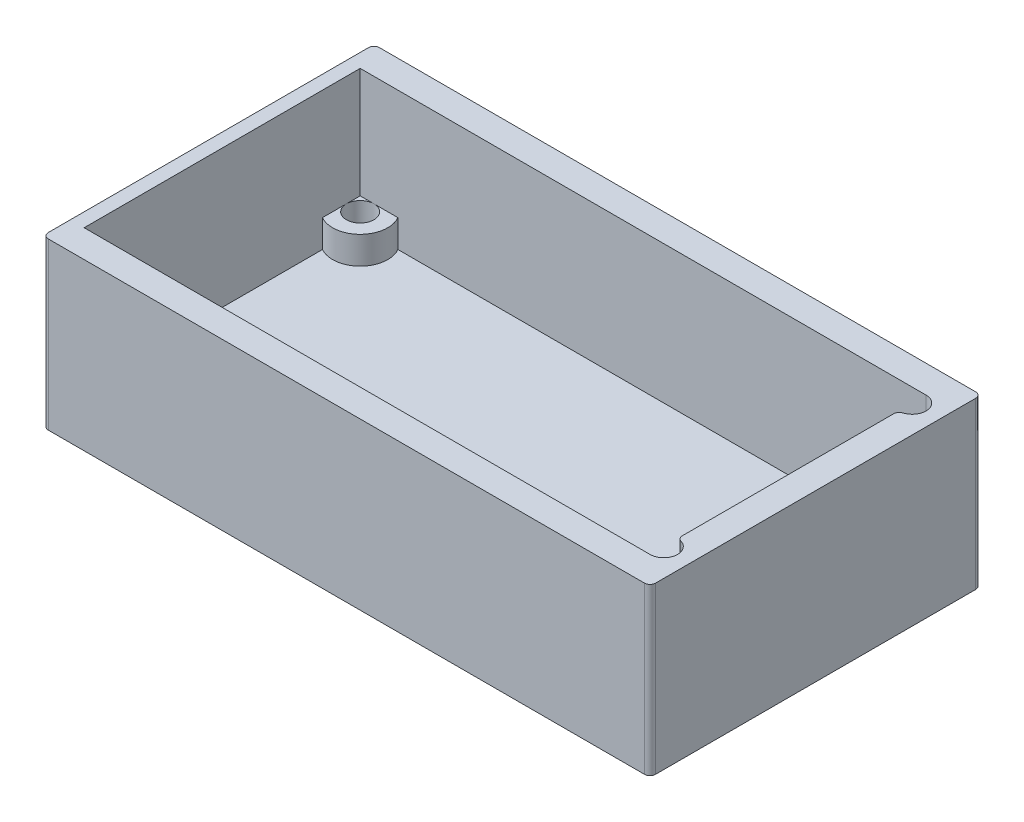
ISO-10303-21;
HEADER;
FILE_DESCRIPTION(('STEP AP214'),'2;1');
FILE_NAME('part.step','',(''),(''),'','','');
FILE_SCHEMA(('AUTOMOTIVE_DESIGN { 1 0 10303 214 1 1 1 1 }'));
ENDSEC;
DATA;
#1=APPLICATION_CONTEXT('core data for automotive mechanical design processes');
#2=APPLICATION_PROTOCOL_DEFINITION('international standard','automotive_design',2000,#1);
#3=PRODUCT_CONTEXT('',#1,'mechanical');
#4=PRODUCT('Part','Part','',(#3));
#5=PRODUCT_RELATED_PRODUCT_CATEGORY('part','',(#4));
#6=PRODUCT_DEFINITION_FORMATION('','',#4);
#7=PRODUCT_DEFINITION_CONTEXT('part definition',#1,'design');
#8=PRODUCT_DEFINITION('design','',#6,#7);
#9=PRODUCT_DEFINITION_SHAPE('','',#8);
#10=(LENGTH_UNIT() NAMED_UNIT(*) SI_UNIT(.MILLI.,.METRE.));
#11=(NAMED_UNIT(*) PLANE_ANGLE_UNIT() SI_UNIT($,.RADIAN.));
#12=(NAMED_UNIT(*) SI_UNIT($,.STERADIAN.) SOLID_ANGLE_UNIT());
#13=UNCERTAINTY_MEASURE_WITH_UNIT(LENGTH_MEASURE(1.E-05),#10,'distance_accuracy_value','');
#14=(GEOMETRIC_REPRESENTATION_CONTEXT(3) GLOBAL_UNCERTAINTY_ASSIGNED_CONTEXT((#13)) GLOBAL_UNIT_ASSIGNED_CONTEXT((#10,
#11,#12)) REPRESENTATION_CONTEXT('',''));
#15=CARTESIAN_POINT('',(0.,0.,0.));
#16=DIRECTION('',(0.,0.,1.));
#17=DIRECTION('',(1.,0.,0.));
#18=AXIS2_PLACEMENT_3D('',#15,#16,#17);
#19=CARTESIAN_POINT('',(10.,2.,-4.5));
#20=DIRECTION('',(0.,-1.,0.));
#21=DIRECTION('',(0.,0.,-1.));
#22=AXIS2_PLACEMENT_3D('',#19,#20,#21);
#23=CYLINDRICAL_SURFACE('',#22,0.500000000000001);
#24=CARTESIAN_POINT('',(10.,2.,-4.5));
#25=DIRECTION('',(0.,1.,0.));
#26=DIRECTION('',(0.,0.,1.));
#27=AXIS2_PLACEMENT_3D('',#24,#25,#26);
#28=CIRCLE('',#27,0.500000000000001);
#29=CARTESIAN_POINT('',(10.,2.,-5.));
#30=VERTEX_POINT('',#29);
#31=CARTESIAN_POINT('',(10.1428571428571,2.,-4.02084257625004));
#32=VERTEX_POINT('',#31);
#33=EDGE_CURVE('E49',#30,#32,#28,.T.);
#34=ORIENTED_EDGE('',*,*,#33,.T.);
#35=DIRECTION('',(0.,-1.,0.));
#36=VECTOR('',#35,1.);
#37=CARTESIAN_POINT('',(10.1428571428571,2.,-4.02084257625004));
#38=LINE('',#37,#36);
#39=CARTESIAN_POINT('',(10.1428571428571,6.,-4.02084257625004));
#40=VERTEX_POINT('',#39);
#41=EDGE_CURVE('E53',#32,#40,#38,.F.);
#42=ORIENTED_EDGE('',*,*,#41,.T.);
#43=CARTESIAN_POINT('',(10.,6.,-4.5));
#44=DIRECTION('',(0.,1.,0.));
#45=DIRECTION('',(0.,0.,1.));
#46=AXIS2_PLACEMENT_3D('',#43,#44,#45);
#47=CIRCLE('',#46,0.500000000000001);
#48=CARTESIAN_POINT('',(10.,6.,-5.));
#49=VERTEX_POINT('',#48);
#50=EDGE_CURVE('E230',#40,#49,#47,.T.);
#51=ORIENTED_EDGE('',*,*,#50,.T.);
#52=DIRECTION('',(0.,1.,0.));
#53=VECTOR('',#52,1.);
#54=CARTESIAN_POINT('',(10.,1.,-5.));
#55=LINE('',#54,#53);
#56=EDGE_CURVE('E248',#30,#49,#55,.T.);
#57=ORIENTED_EDGE('',*,*,#56,.F.);
#58=EDGE_LOOP('',(#34,#42,#51,#57));
#59=FACE_BOUND('',#58,.T.);
#60=CARTESIAN_POINT('',(10.,1.,-4.5));
#61=DIRECTION('',(0.,-1.,0.));
#62=DIRECTION('',(0.,0.,-1.));
#63=AXIS2_PLACEMENT_3D('',#60,#61,#62);
#64=CIRCLE('',#63,0.500000000000001);
#65=CARTESIAN_POINT('',(10.,1.,-5.));
#66=VERTEX_POINT('',#65);
#67=EDGE_CURVE('E36',#66,#66,#64,.T.);
#68=ORIENTED_EDGE('',*,*,#67,.T.);
#69=EDGE_LOOP('',(#68));
#70=FACE_BOUND('',#69,.T.);
#71=ADVANCED_FACE('F32',(#59,#70),#23,.F.);
#72=CARTESIAN_POINT('',(-10.,2.,-4.5));
#73=DIRECTION('',(0.,-1.,0.));
#74=DIRECTION('',(0.,0.,-1.));
#75=AXIS2_PLACEMENT_3D('',#72,#73,#74);
#76=CYLINDRICAL_SURFACE('',#75,0.499999999999999);
#77=CARTESIAN_POINT('',(-10.,2.,-4.5));
#78=DIRECTION('',(0.,1.,0.));
#79=DIRECTION('',(0.,0.,1.));
#80=AXIS2_PLACEMENT_3D('',#77,#78,#79);
#81=CIRCLE('',#80,0.499999999999999);
#82=CARTESIAN_POINT('',(-10.,2.,-5.));
#83=VERTEX_POINT('',#82);
#84=CARTESIAN_POINT('',(-10.5,2.,-4.5));
#85=VERTEX_POINT('',#84);
#86=EDGE_CURVE('E392',#83,#85,#81,.T.);
#87=ORIENTED_EDGE('',*,*,#86,.T.);
#88=EDGE_CURVE('E396',#85,#83,#81,.T.);
#89=ORIENTED_EDGE('',*,*,#88,.T.);
#90=EDGE_LOOP('',(#87,#89));
#91=FACE_BOUND('',#90,.T.);
#92=CARTESIAN_POINT('',(-10.,1.,-4.5));
#93=DIRECTION('',(0.,-1.,0.));
#94=DIRECTION('',(0.,0.,-1.));
#95=AXIS2_PLACEMENT_3D('',#92,#93,#94);
#96=CIRCLE('',#95,0.499999999999999);
#97=CARTESIAN_POINT('',(-10.,1.,-5.));
#98=VERTEX_POINT('',#97);
#99=EDGE_CURVE('E350',#98,#98,#96,.T.);
#100=ORIENTED_EDGE('',*,*,#99,.T.);
#101=EDGE_LOOP('',(#100));
#102=FACE_BOUND('',#101,.T.);
#103=ADVANCED_FACE('F502',(#91,#102),#76,.F.);
#104=CARTESIAN_POINT('',(-10.,2.,4.5));
#105=DIRECTION('',(0.,-1.,0.));
#106=DIRECTION('',(0.,0.,-1.));
#107=AXIS2_PLACEMENT_3D('',#104,#105,#106);
#108=CYLINDRICAL_SURFACE('',#107,0.499999999999999);
#109=CARTESIAN_POINT('',(-10.,2.,4.5));
#110=DIRECTION('',(0.,-1.,0.));
#111=DIRECTION('',(0.,0.,-1.));
#112=AXIS2_PLACEMENT_3D('',#109,#110,#111);
#113=CIRCLE('',#112,0.499999999999999);
#114=CARTESIAN_POINT('',(-10.,2.,5.));
#115=VERTEX_POINT('',#114);
#116=CARTESIAN_POINT('',(-10.5,2.,4.5));
#117=VERTEX_POINT('',#116);
#118=EDGE_CURVE('E377',#115,#117,#113,.T.);
#119=ORIENTED_EDGE('',*,*,#118,.F.);
#120=EDGE_CURVE('E376',#117,#115,#113,.T.);
#121=ORIENTED_EDGE('',*,*,#120,.F.);
#122=EDGE_LOOP('',(#119,#121));
#123=FACE_BOUND('',#122,.T.);
#124=CARTESIAN_POINT('',(-10.,1.,4.5));
#125=DIRECTION('',(0.,-1.,0.));
#126=DIRECTION('',(0.,0.,-1.));
#127=AXIS2_PLACEMENT_3D('',#124,#125,#126);
#128=CIRCLE('',#127,0.499999999999999);
#129=CARTESIAN_POINT('',(-10.,1.,4.));
#130=VERTEX_POINT('',#129);
#131=EDGE_CURVE('E346',#130,#130,#128,.F.);
#132=ORIENTED_EDGE('',*,*,#131,.F.);
#133=EDGE_LOOP('',(#132));
#134=FACE_BOUND('',#133,.T.);
#135=ADVANCED_FACE('F522',(#123,#134),#108,.F.);
#136=CARTESIAN_POINT('',(10.,2.,4.5));
#137=DIRECTION('',(0.,-1.,0.));
#138=DIRECTION('',(0.,0.,-1.));
#139=AXIS2_PLACEMENT_3D('',#136,#137,#138);
#140=CYLINDRICAL_SURFACE('',#139,0.500000000000001);
#141=CARTESIAN_POINT('',(10.,6.,4.5));
#142=DIRECTION('',(0.,-1.,0.));
#143=DIRECTION('',(0.,0.,-1.));
#144=AXIS2_PLACEMENT_3D('',#141,#142,#143);
#145=CIRCLE('',#144,0.500000000000001);
#146=CARTESIAN_POINT('',(10.1428571428571,6.,4.02084257625004));
#147=VERTEX_POINT('',#146);
#148=CARTESIAN_POINT('',(10.,6.,5.));
#149=VERTEX_POINT('',#148);
#150=EDGE_CURVE('E221',#147,#149,#145,.T.);
#151=ORIENTED_EDGE('',*,*,#150,.F.);
#152=DIRECTION('',(0.,-1.,0.));
#153=VECTOR('',#152,1.);
#154=CARTESIAN_POINT('',(10.1428571428571,2.,4.02084257625004));
#155=LINE('',#154,#153);
#156=CARTESIAN_POINT('',(10.1428571428571,2.,4.02084257625004));
#157=VERTEX_POINT('',#156);
#158=EDGE_CURVE('E331',#147,#157,#155,.T.);
#159=ORIENTED_EDGE('',*,*,#158,.T.);
#160=CARTESIAN_POINT('',(10.,2.,4.5));
#161=DIRECTION('',(0.,-1.,0.));
#162=DIRECTION('',(0.,0.,-1.));
#163=AXIS2_PLACEMENT_3D('',#160,#161,#162);
#164=CIRCLE('',#163,0.500000000000001);
#165=CARTESIAN_POINT('',(10.,2.,5.));
#166=VERTEX_POINT('',#165);
#167=EDGE_CURVE('E236',#166,#157,#164,.T.);
#168=ORIENTED_EDGE('',*,*,#167,.F.);
#169=DIRECTION('',(0.,1.,0.));
#170=VECTOR('',#169,1.);
#171=CARTESIAN_POINT('',(10.,1.,5.));
#172=LINE('',#171,#170);
#173=EDGE_CURVE('E210',#166,#149,#172,.T.);
#174=ORIENTED_EDGE('',*,*,#173,.T.);
#175=EDGE_LOOP('',(#151,#159,#168,#174));
#176=FACE_BOUND('',#175,.T.);
#177=CARTESIAN_POINT('',(10.,1.,4.5));
#178=DIRECTION('',(0.,-1.,0.));
#179=DIRECTION('',(0.,0.,-1.));
#180=AXIS2_PLACEMENT_3D('',#177,#178,#179);
#181=CIRCLE('',#180,0.500000000000001);
#182=CARTESIAN_POINT('',(10.,1.,4.));
#183=VERTEX_POINT('',#182);
#184=EDGE_CURVE('E231',#183,#183,#181,.F.);
#185=ORIENTED_EDGE('',*,*,#184,.F.);
#186=EDGE_LOOP('',(#185));
#187=FACE_BOUND('',#186,.T.);
#188=ADVANCED_FACE('F234',(#176,#187),#140,.F.);
#189=CARTESIAN_POINT('',(10.,1.,5.));
#190=DIRECTION('',(1.,0.,0.));
#191=DIRECTION('',(0.,0.,-1.));
#192=AXIS2_PLACEMENT_3D('',#189,#190,#191);
#193=PLANE('',#192);
#194=DIRECTION('',(0.,0.,1.));
#195=VECTOR('',#194,1.);
#196=CARTESIAN_POINT('',(10.,2.,5.));
#197=LINE('',#196,#195);
#198=CARTESIAN_POINT('',(10.,2.,3.5));
#199=VERTEX_POINT('',#198);
#200=CARTESIAN_POINT('',(10.,2.,3.82917960675006));
#201=VERTEX_POINT('',#200);
#202=EDGE_CURVE('E417',#199,#201,#197,.T.);
#203=ORIENTED_EDGE('',*,*,#202,.T.);
#204=DIRECTION('',(0.,-1.,0.));
#205=VECTOR('',#204,1.);
#206=CARTESIAN_POINT('',(10.,1.,3.82917960675006));
#207=LINE('',#206,#205);
#208=CARTESIAN_POINT('',(10.,6.,3.82917960675006));
#209=VERTEX_POINT('',#208);
#210=EDGE_CURVE('E336',#201,#209,#207,.F.);
#211=ORIENTED_EDGE('',*,*,#210,.T.);
#212=DIRECTION('',(0.,0.,-1.));
#213=VECTOR('',#212,1.);
#214=CARTESIAN_POINT('',(10.,6.,5.));
#215=LINE('',#214,#213);
#216=CARTESIAN_POINT('',(10.,6.,-3.82917960675006));
#217=VERTEX_POINT('',#216);
#218=EDGE_CURVE('E431',#209,#217,#215,.T.);
#219=ORIENTED_EDGE('',*,*,#218,.T.);
#220=DIRECTION('',(0.,1.,0.));
#221=VECTOR('',#220,1.);
#222=CARTESIAN_POINT('',(10.,2.,-3.82917960675006));
#223=LINE('',#222,#221);
#224=CARTESIAN_POINT('',(10.,2.,-3.82917960675006));
#225=VERTEX_POINT('',#224);
#226=EDGE_CURVE('E333',#217,#225,#223,.F.);
#227=ORIENTED_EDGE('',*,*,#226,.T.);
#228=DIRECTION('',(0.,0.,1.));
#229=VECTOR('',#228,1.);
#230=CARTESIAN_POINT('',(10.,2.,5.));
#231=LINE('',#230,#229);
#232=CARTESIAN_POINT('',(10.,2.,-3.5));
#233=VERTEX_POINT('',#232);
#234=EDGE_CURVE('E429',#225,#233,#231,.T.);
#235=ORIENTED_EDGE('',*,*,#234,.T.);
#236=DIRECTION('',(0.,-1.,0.));
#237=VECTOR('',#236,1.);
#238=CARTESIAN_POINT('',(10.,2.,-3.5));
#239=LINE('',#238,#237);
#240=CARTESIAN_POINT('',(10.,1.,-3.5));
#241=VERTEX_POINT('',#240);
#242=EDGE_CURVE('E426',#241,#233,#239,.F.);
#243=ORIENTED_EDGE('',*,*,#242,.F.);
#244=DIRECTION('',(0.,0.,-1.));
#245=VECTOR('',#244,1.);
#246=CARTESIAN_POINT('',(10.,1.,5.));
#247=LINE('',#246,#245);
#248=CARTESIAN_POINT('',(10.,1.,3.5));
#249=VERTEX_POINT('',#248);
#250=EDGE_CURVE('E217',#249,#241,#247,.T.);
#251=ORIENTED_EDGE('',*,*,#250,.F.);
#252=DIRECTION('',(0.,-1.,0.));
#253=VECTOR('',#252,1.);
#254=CARTESIAN_POINT('',(10.,2.,3.5));
#255=LINE('',#254,#253);
#256=EDGE_CURVE('E415',#249,#199,#255,.F.);
#257=ORIENTED_EDGE('',*,*,#256,.T.);
#258=EDGE_LOOP('',(#203,#211,#219,#227,#235,#243,#251,#257));
#259=FACE_BOUND('',#258,.T.);
#260=ADVANCED_FACE('F460',(#259),#193,.F.);
#261=CARTESIAN_POINT('',(-10.5,1.,-5.));
#262=DIRECTION('',(0.,0.,-1.));
#263=DIRECTION('',(-1.,0.,0.));
#264=AXIS2_PLACEMENT_3D('',#261,#262,#263);
#265=PLANE('',#264);
#266=DIRECTION('',(-1.,0.,0.));
#267=VECTOR('',#266,1.);
#268=CARTESIAN_POINT('',(-10.5,6.,-5.));
#269=LINE('',#268,#267);
#270=CARTESIAN_POINT('',(-10.5,6.,-5.));
#271=VERTEX_POINT('',#270);
#272=EDGE_CURVE('E441',#49,#271,#269,.T.);
#273=ORIENTED_EDGE('',*,*,#272,.T.);
#274=DIRECTION('',(0.,1.,0.));
#275=VECTOR('',#274,1.);
#276=CARTESIAN_POINT('',(-10.5,1.,-5.));
#277=LINE('',#276,#275);
#278=CARTESIAN_POINT('',(-10.5,2.,-5.));
#279=VERTEX_POINT('',#278);
#280=EDGE_CURVE('E242',#279,#271,#277,.T.);
#281=ORIENTED_EDGE('',*,*,#280,.F.);
#282=DIRECTION('',(1.,0.,0.));
#283=VECTOR('',#282,1.);
#284=CARTESIAN_POINT('',(-10.5,2.,-5.));
#285=LINE('',#284,#283);
#286=EDGE_CURVE('E323',#279,#83,#285,.T.);
#287=ORIENTED_EDGE('',*,*,#286,.T.);
#288=CARTESIAN_POINT('',(-9.13397459621556,2.,-5.));
#289=VERTEX_POINT('',#288);
#290=EDGE_CURVE('E321',#83,#289,#285,.T.);
#291=ORIENTED_EDGE('',*,*,#290,.T.);
#292=DIRECTION('',(0.,-1.,0.));
#293=VECTOR('',#292,1.);
#294=CARTESIAN_POINT('',(-9.13397459621556,2.,-5.));
#295=LINE('',#294,#293);
#296=CARTESIAN_POINT('',(-9.13397459621556,1.,-5.));
#297=VERTEX_POINT('',#296);
#298=EDGE_CURVE('E399',#297,#289,#295,.F.);
#299=ORIENTED_EDGE('',*,*,#298,.F.);
#300=DIRECTION('',(-1.,0.,0.));
#301=VECTOR('',#300,1.);
#302=CARTESIAN_POINT('',(-10.5,1.,-5.));
#303=LINE('',#302,#301);
#304=CARTESIAN_POINT('',(9.13397459621556,1.,-5.));
#305=VERTEX_POINT('',#304);
#306=EDGE_CURVE('E433',#305,#297,#303,.T.);
#307=ORIENTED_EDGE('',*,*,#306,.F.);
#308=DIRECTION('',(0.,-1.,0.));
#309=VECTOR('',#308,1.);
#310=CARTESIAN_POINT('',(9.13397459621556,2.,-5.));
#311=LINE('',#310,#309);
#312=CARTESIAN_POINT('',(9.13397459621556,2.,-5.));
#313=VERTEX_POINT('',#312);
#314=EDGE_CURVE('E424',#313,#305,#311,.T.);
#315=ORIENTED_EDGE('',*,*,#314,.F.);
#316=DIRECTION('',(1.,0.,0.));
#317=VECTOR('',#316,1.);
#318=CARTESIAN_POINT('',(-10.5,2.,-5.));
#319=LINE('',#318,#317);
#320=EDGE_CURVE('E311',#313,#30,#319,.T.);
#321=ORIENTED_EDGE('',*,*,#320,.T.);
#322=ORIENTED_EDGE('',*,*,#56,.T.);
#323=EDGE_LOOP('',(#273,#281,#287,#291,#299,#307,#315,#321,#322));
#324=FACE_BOUND('',#323,.T.);
#325=ADVANCED_FACE('F449',(#324),#265,.F.);
#326=CARTESIAN_POINT('',(11.,6.,6.));
#327=DIRECTION('',(-1.,0.,0.));
#328=DIRECTION('',(0.,0.,1.));
#329=AXIS2_PLACEMENT_3D('',#326,#327,#328);
#330=PLANE('',#329);
#331=DIRECTION('',(0.,0.,-1.));
#332=VECTOR('',#331,1.);
#333=CARTESIAN_POINT('',(11.,0.,6.));
#334=LINE('',#333,#332);
#335=CARTESIAN_POINT('',(11.,0.,5.8));
#336=VERTEX_POINT('',#335);
#337=CARTESIAN_POINT('',(11.,0.,-5.8));
#338=VERTEX_POINT('',#337);
#339=EDGE_CURVE('E237',#336,#338,#334,.T.);
#340=ORIENTED_EDGE('',*,*,#339,.T.);
#341=DIRECTION('',(0.,-1.,0.));
#342=VECTOR('',#341,1.);
#343=CARTESIAN_POINT('',(11.,6.,-5.8));
#344=LINE('',#343,#342);
#345=CARTESIAN_POINT('',(11.,6.,-5.8));
#346=VERTEX_POINT('',#345);
#347=EDGE_CURVE('E301',#338,#346,#344,.F.);
#348=ORIENTED_EDGE('',*,*,#347,.T.);
#349=DIRECTION('',(0.,0.,-1.));
#350=VECTOR('',#349,1.);
#351=CARTESIAN_POINT('',(11.,6.,6.));
#352=LINE('',#351,#350);
#353=CARTESIAN_POINT('',(11.,6.,5.8));
#354=VERTEX_POINT('',#353);
#355=EDGE_CURVE('E252',#354,#346,#352,.T.);
#356=ORIENTED_EDGE('',*,*,#355,.F.);
#357=DIRECTION('',(0.,-1.,0.));
#358=VECTOR('',#357,1.);
#359=CARTESIAN_POINT('',(11.,6.,5.8));
#360=LINE('',#359,#358);
#361=EDGE_CURVE('E298',#354,#336,#360,.T.);
#362=ORIENTED_EDGE('',*,*,#361,.T.);
#363=EDGE_LOOP('',(#340,#348,#356,#362));
#364=FACE_BOUND('',#363,.T.);
#365=ADVANCED_FACE('F538',(#364),#330,.F.);
#366=CARTESIAN_POINT('',(-11.,6.,-6.));
#367=DIRECTION('',(0.,0.,1.));
#368=DIRECTION('',(1.,0.,0.));
#369=AXIS2_PLACEMENT_3D('',#366,#367,#368);
#370=PLANE('',#369);
#371=DIRECTION('',(-1.,0.,0.));
#372=VECTOR('',#371,1.);
#373=CARTESIAN_POINT('',(-11.,0.,-6.));
#374=LINE('',#373,#372);
#375=CARTESIAN_POINT('',(10.8,0.,-6.));
#376=VERTEX_POINT('',#375);
#377=CARTESIAN_POINT('',(-10.8,0.,-6.));
#378=VERTEX_POINT('',#377);
#379=EDGE_CURVE('E240',#376,#378,#374,.T.);
#380=ORIENTED_EDGE('',*,*,#379,.T.);
#381=DIRECTION('',(0.,-1.,0.));
#382=VECTOR('',#381,1.);
#383=CARTESIAN_POINT('',(-10.8,6.,-6.));
#384=LINE('',#383,#382);
#385=CARTESIAN_POINT('',(-10.8,6.,-6.));
#386=VERTEX_POINT('',#385);
#387=EDGE_CURVE('E288',#378,#386,#384,.F.);
#388=ORIENTED_EDGE('',*,*,#387,.T.);
#389=DIRECTION('',(-1.,0.,0.));
#390=VECTOR('',#389,1.);
#391=CARTESIAN_POINT('',(-11.,6.,-6.));
#392=LINE('',#391,#390);
#393=CARTESIAN_POINT('',(10.8,6.,-6.));
#394=VERTEX_POINT('',#393);
#395=EDGE_CURVE('E255',#394,#386,#392,.T.);
#396=ORIENTED_EDGE('',*,*,#395,.F.);
#397=DIRECTION('',(0.,-1.,0.));
#398=VECTOR('',#397,1.);
#399=CARTESIAN_POINT('',(10.8,6.,-6.));
#400=LINE('',#399,#398);
#401=EDGE_CURVE('E285',#394,#376,#400,.T.);
#402=ORIENTED_EDGE('',*,*,#401,.T.);
#403=EDGE_LOOP('',(#380,#388,#396,#402));
#404=FACE_BOUND('',#403,.T.);
#405=ADVANCED_FACE('F555',(#404),#370,.F.);
#406=CARTESIAN_POINT('',(-11.,6.,6.));
#407=DIRECTION('',(1.,0.,0.));
#408=DIRECTION('',(0.,0.,-1.));
#409=AXIS2_PLACEMENT_3D('',#406,#407,#408);
#410=PLANE('',#409);
#411=DIRECTION('',(0.,0.,1.));
#412=VECTOR('',#411,1.);
#413=CARTESIAN_POINT('',(-11.,6.,6.));
#414=LINE('',#413,#412);
#415=CARTESIAN_POINT('',(-11.,6.,-5.8));
#416=VERTEX_POINT('',#415);
#417=CARTESIAN_POINT('',(-11.,6.,5.8));
#418=VERTEX_POINT('',#417);
#419=EDGE_CURVE('E259',#416,#418,#414,.T.);
#420=ORIENTED_EDGE('',*,*,#419,.F.);
#421=DIRECTION('',(0.,-1.,0.));
#422=VECTOR('',#421,1.);
#423=CARTESIAN_POINT('',(-11.,6.,-5.8));
#424=LINE('',#423,#422);
#425=CARTESIAN_POINT('',(-11.,0.,-5.8));
#426=VERTEX_POINT('',#425);
#427=EDGE_CURVE('E274',#416,#426,#424,.T.);
#428=ORIENTED_EDGE('',*,*,#427,.T.);
#429=DIRECTION('',(0.,0.,1.));
#430=VECTOR('',#429,1.);
#431=CARTESIAN_POINT('',(-11.,0.,6.));
#432=LINE('',#431,#430);
#433=CARTESIAN_POINT('',(-11.,0.,5.8));
#434=VERTEX_POINT('',#433);
#435=EDGE_CURVE('E268',#426,#434,#432,.T.);
#436=ORIENTED_EDGE('',*,*,#435,.T.);
#437=DIRECTION('',(0.,-1.,0.));
#438=VECTOR('',#437,1.);
#439=CARTESIAN_POINT('',(-11.,6.,5.8));
#440=LINE('',#439,#438);
#441=EDGE_CURVE('E264',#434,#418,#440,.F.);
#442=ORIENTED_EDGE('',*,*,#441,.T.);
#443=EDGE_LOOP('',(#420,#428,#436,#442));
#444=FACE_BOUND('',#443,.T.);
#445=ADVANCED_FACE('F551',(#444),#410,.F.);
#446=CARTESIAN_POINT('',(-11.,6.,6.));
#447=DIRECTION('',(0.,0.,-1.));
#448=DIRECTION('',(-1.,0.,0.));
#449=AXIS2_PLACEMENT_3D('',#446,#447,#448);
#450=PLANE('',#449);
#451=DIRECTION('',(1.,0.,0.));
#452=VECTOR('',#451,1.);
#453=CARTESIAN_POINT('',(-11.,0.,6.));
#454=LINE('',#453,#452);
#455=CARTESIAN_POINT('',(-10.8,0.,6.));
#456=VERTEX_POINT('',#455);
#457=CARTESIAN_POINT('',(10.8,0.,6.));
#458=VERTEX_POINT('',#457);
#459=EDGE_CURVE('E256',#456,#458,#454,.T.);
#460=ORIENTED_EDGE('',*,*,#459,.T.);
#461=DIRECTION('',(0.,-1.,0.));
#462=VECTOR('',#461,1.);
#463=CARTESIAN_POINT('',(10.8,6.,6.));
#464=LINE('',#463,#462);
#465=CARTESIAN_POINT('',(10.8,6.,6.));
#466=VERTEX_POINT('',#465);
#467=EDGE_CURVE('E306',#458,#466,#464,.F.);
#468=ORIENTED_EDGE('',*,*,#467,.T.);
#469=DIRECTION('',(1.,0.,0.));
#470=VECTOR('',#469,1.);
#471=CARTESIAN_POINT('',(-11.,6.,6.));
#472=LINE('',#471,#470);
#473=CARTESIAN_POINT('',(-10.8,6.,6.));
#474=VERTEX_POINT('',#473);
#475=EDGE_CURVE('E262',#474,#466,#472,.T.);
#476=ORIENTED_EDGE('',*,*,#475,.F.);
#477=DIRECTION('',(0.,-1.,0.));
#478=VECTOR('',#477,1.);
#479=CARTESIAN_POINT('',(-10.8,6.,6.));
#480=LINE('',#479,#478);
#481=EDGE_CURVE('E303',#474,#456,#480,.T.);
#482=ORIENTED_EDGE('',*,*,#481,.T.);
#483=EDGE_LOOP('',(#460,#468,#476,#482));
#484=FACE_BOUND('',#483,.T.);
#485=ADVANCED_FACE('F544',(#484),#450,.F.);
#486=CARTESIAN_POINT('',(0.,6.,0.));
#487=DIRECTION('',(0.,-1.,0.));
#488=DIRECTION('',(0.,0.,-1.));
#489=AXIS2_PLACEMENT_3D('',#486,#487,#488);
#490=PLANE('',#489);
#491=ORIENTED_EDGE('',*,*,#218,.F.);
#492=CARTESIAN_POINT('',(10.2,6.,3.82917960675006));
#493=DIRECTION('',(0.,-1.,0.));
#494=DIRECTION('',(0.,0.,-1.));
#495=AXIS2_PLACEMENT_3D('',#492,#493,#494);
#496=CIRCLE('',#495,0.2);
#497=EDGE_CURVE('E226',#209,#147,#496,.F.);
#498=ORIENTED_EDGE('',*,*,#497,.T.);
#499=ORIENTED_EDGE('',*,*,#150,.T.);
#500=DIRECTION('',(1.,0.,0.));
#501=VECTOR('',#500,1.);
#502=CARTESIAN_POINT('',(-10.5,6.,5.));
#503=LINE('',#502,#501);
#504=CARTESIAN_POINT('',(-10.5,6.,5.));
#505=VERTEX_POINT('',#504);
#506=EDGE_CURVE('E205',#505,#149,#503,.T.);
#507=ORIENTED_EDGE('',*,*,#506,.F.);
#508=DIRECTION('',(0.,0.,1.));
#509=VECTOR('',#508,1.);
#510=CARTESIAN_POINT('',(-10.5,6.,5.));
#511=LINE('',#510,#509);
#512=EDGE_CURVE('E218',#271,#505,#511,.T.);
#513=ORIENTED_EDGE('',*,*,#512,.F.);
#514=ORIENTED_EDGE('',*,*,#272,.F.);
#515=ORIENTED_EDGE('',*,*,#50,.F.);
#516=CARTESIAN_POINT('',(10.2,6.,-3.82917960675006));
#517=DIRECTION('',(0.,-1.,0.));
#518=DIRECTION('',(0.,0.,-1.));
#519=AXIS2_PLACEMENT_3D('',#516,#517,#518);
#520=CIRCLE('',#519,0.2);
#521=EDGE_CURVE('E338',#40,#217,#520,.F.);
#522=ORIENTED_EDGE('',*,*,#521,.T.);
#523=EDGE_LOOP('',(#491,#498,#499,#507,#513,#514,#515,#522));
#524=FACE_BOUND('',#523,.T.);
#525=ORIENTED_EDGE('',*,*,#395,.T.);
#526=CARTESIAN_POINT('',(-10.8,6.,-5.8));
#527=DIRECTION('',(0.,-1.,0.));
#528=DIRECTION('',(0.,0.,-1.));
#529=AXIS2_PLACEMENT_3D('',#526,#527,#528);
#530=CIRCLE('',#529,0.2);
#531=EDGE_CURVE('E296',#386,#416,#530,.F.);
#532=ORIENTED_EDGE('',*,*,#531,.T.);
#533=ORIENTED_EDGE('',*,*,#419,.T.);
#534=CARTESIAN_POINT('',(-10.8,6.,5.8));
#535=DIRECTION('',(0.,-1.,0.));
#536=DIRECTION('',(0.,0.,-1.));
#537=AXIS2_PLACEMENT_3D('',#534,#535,#536);
#538=CIRCLE('',#537,0.2);
#539=EDGE_CURVE('E290',#418,#474,#538,.F.);
#540=ORIENTED_EDGE('',*,*,#539,.T.);
#541=ORIENTED_EDGE('',*,*,#475,.T.);
#542=CARTESIAN_POINT('',(10.8,6.,5.8));
#543=DIRECTION('',(0.,-1.,0.));
#544=DIRECTION('',(0.,0.,-1.));
#545=AXIS2_PLACEMENT_3D('',#542,#543,#544);
#546=CIRCLE('',#545,0.2);
#547=EDGE_CURVE('E292',#466,#354,#546,.F.);
#548=ORIENTED_EDGE('',*,*,#547,.T.);
#549=ORIENTED_EDGE('',*,*,#355,.T.);
#550=CARTESIAN_POINT('',(10.8,6.,-5.8));
#551=DIRECTION('',(0.,-1.,0.));
#552=DIRECTION('',(0.,0.,-1.));
#553=AXIS2_PLACEMENT_3D('',#550,#551,#552);
#554=CIRCLE('',#553,0.2);
#555=EDGE_CURVE('E294',#346,#394,#554,.F.);
#556=ORIENTED_EDGE('',*,*,#555,.T.);
#557=EDGE_LOOP('',(#525,#532,#533,#540,#541,#548,#549,#556));
#558=FACE_BOUND('',#557,.T.);
#559=ADVANCED_FACE('F223',(#524,#558),#490,.F.);
#560=CARTESIAN_POINT('',(0.,0.,0.));
#561=DIRECTION('',(0.,-1.,0.));
#562=DIRECTION('',(0.,0.,-1.));
#563=AXIS2_PLACEMENT_3D('',#560,#561,#562);
#564=PLANE('',#563);
#565=CARTESIAN_POINT('',(10.,0.,-4.5));
#566=DIRECTION('',(0.,1.,0.));
#567=DIRECTION('',(0.,0.,1.));
#568=AXIS2_PLACEMENT_3D('',#565,#566,#567);
#569=CIRCLE('',#568,0.9);
#570=CARTESIAN_POINT('',(10.,0.,-3.6));
#571=VERTEX_POINT('',#570);
#572=EDGE_CURVE('E366',#571,#571,#569,.T.);
#573=ORIENTED_EDGE('',*,*,#572,.T.);
#574=EDGE_LOOP('',(#573));
#575=FACE_BOUND('',#574,.T.);
#576=CARTESIAN_POINT('',(-10.,0.,-4.5));
#577=DIRECTION('',(0.,-1.,0.));
#578=DIRECTION('',(0.,0.,1.));
#579=AXIS2_PLACEMENT_3D('',#576,#577,#578);
#580=CIRCLE('',#579,0.9);
#581=CARTESIAN_POINT('',(-10.,0.,-3.6));
#582=VERTEX_POINT('',#581);
#583=EDGE_CURVE('E359',#582,#582,#580,.T.);
#584=ORIENTED_EDGE('',*,*,#583,.F.);
#585=EDGE_LOOP('',(#584));
#586=FACE_BOUND('',#585,.T.);
#587=CARTESIAN_POINT('',(-10.,0.,4.5));
#588=DIRECTION('',(0.,1.,0.));
#589=DIRECTION('',(0.,0.,-1.));
#590=AXIS2_PLACEMENT_3D('',#587,#588,#589);
#591=CIRCLE('',#590,0.9);
#592=CARTESIAN_POINT('',(-10.,0.,3.6));
#593=VERTEX_POINT('',#592);
#594=EDGE_CURVE('E352',#593,#593,#591,.T.);
#595=ORIENTED_EDGE('',*,*,#594,.T.);
#596=EDGE_LOOP('',(#595));
#597=FACE_BOUND('',#596,.T.);
#598=CARTESIAN_POINT('',(10.,0.,4.5));
#599=DIRECTION('',(0.,-1.,0.));
#600=DIRECTION('',(0.,0.,-1.));
#601=AXIS2_PLACEMENT_3D('',#598,#599,#600);
#602=CIRCLE('',#601,0.9);
#603=CARTESIAN_POINT('',(10.,0.,3.6));
#604=VERTEX_POINT('',#603);
#605=EDGE_CURVE('E348',#604,#604,#602,.T.);
#606=ORIENTED_EDGE('',*,*,#605,.F.);
#607=EDGE_LOOP('',(#606));
#608=FACE_BOUND('',#607,.T.);
#609=ORIENTED_EDGE('',*,*,#435,.F.);
#610=CARTESIAN_POINT('',(-10.8,0.,-5.8));
#611=DIRECTION('',(0.,-1.,0.));
#612=DIRECTION('',(0.,0.,-1.));
#613=AXIS2_PLACEMENT_3D('',#610,#611,#612);
#614=CIRCLE('',#613,0.2);
#615=EDGE_CURVE('E283',#426,#378,#614,.T.);
#616=ORIENTED_EDGE('',*,*,#615,.T.);
#617=ORIENTED_EDGE('',*,*,#379,.F.);
#618=CARTESIAN_POINT('',(10.8,0.,-5.8));
#619=DIRECTION('',(0.,-1.,0.));
#620=DIRECTION('',(0.,0.,-1.));
#621=AXIS2_PLACEMENT_3D('',#618,#619,#620);
#622=CIRCLE('',#621,0.2);
#623=EDGE_CURVE('E281',#376,#338,#622,.T.);
#624=ORIENTED_EDGE('',*,*,#623,.T.);
#625=ORIENTED_EDGE('',*,*,#339,.F.);
#626=CARTESIAN_POINT('',(10.8,0.,5.8));
#627=DIRECTION('',(0.,-1.,0.));
#628=DIRECTION('',(0.,0.,-1.));
#629=AXIS2_PLACEMENT_3D('',#626,#627,#628);
#630=CIRCLE('',#629,0.2);
#631=EDGE_CURVE('E279',#336,#458,#630,.T.);
#632=ORIENTED_EDGE('',*,*,#631,.T.);
#633=ORIENTED_EDGE('',*,*,#459,.F.);
#634=CARTESIAN_POINT('',(-10.8,0.,5.8));
#635=DIRECTION('',(0.,-1.,0.));
#636=DIRECTION('',(0.,0.,-1.));
#637=AXIS2_PLACEMENT_3D('',#634,#635,#636);
#638=CIRCLE('',#637,0.2);
#639=EDGE_CURVE('E277',#456,#434,#638,.T.);
#640=ORIENTED_EDGE('',*,*,#639,.T.);
#641=EDGE_LOOP('',(#609,#616,#617,#624,#625,#632,#633,#640));
#642=FACE_BOUND('',#641,.T.);
#643=ADVANCED_FACE('F543',(#575,#586,#597,#608,#642),#564,.T.);
#644=CARTESIAN_POINT('',(-10.8,6.,-5.8));
#645=DIRECTION('',(0.,-1.,0.));
#646=DIRECTION('',(0.,0.,-1.));
#647=AXIS2_PLACEMENT_3D('',#644,#645,#646);
#648=CYLINDRICAL_SURFACE('',#647,0.2);
#649=ORIENTED_EDGE('',*,*,#531,.F.);
#650=ORIENTED_EDGE('',*,*,#387,.F.);
#651=ORIENTED_EDGE('',*,*,#615,.F.);
#652=ORIENTED_EDGE('',*,*,#427,.F.);
#653=EDGE_LOOP('',(#649,#650,#651,#652));
#654=FACE_BOUND('',#653,.T.);
#655=ADVANCED_FACE('F547',(#654),#648,.T.);
#656=CARTESIAN_POINT('',(10.8,6.,-5.8));
#657=DIRECTION('',(0.,-1.,0.));
#658=DIRECTION('',(0.,0.,-1.));
#659=AXIS2_PLACEMENT_3D('',#656,#657,#658);
#660=CYLINDRICAL_SURFACE('',#659,0.2);
#661=ORIENTED_EDGE('',*,*,#555,.F.);
#662=ORIENTED_EDGE('',*,*,#347,.F.);
#663=ORIENTED_EDGE('',*,*,#623,.F.);
#664=ORIENTED_EDGE('',*,*,#401,.F.);
#665=EDGE_LOOP('',(#661,#662,#663,#664));
#666=FACE_BOUND('',#665,.T.);
#667=ADVANCED_FACE('F565',(#666),#660,.T.);
#668=CARTESIAN_POINT('',(10.8,6.,5.8));
#669=DIRECTION('',(0.,-1.,0.));
#670=DIRECTION('',(0.,0.,-1.));
#671=AXIS2_PLACEMENT_3D('',#668,#669,#670);
#672=CYLINDRICAL_SURFACE('',#671,0.2);
#673=ORIENTED_EDGE('',*,*,#547,.F.);
#674=ORIENTED_EDGE('',*,*,#467,.F.);
#675=ORIENTED_EDGE('',*,*,#631,.F.);
#676=ORIENTED_EDGE('',*,*,#361,.F.);
#677=EDGE_LOOP('',(#673,#674,#675,#676));
#678=FACE_BOUND('',#677,.T.);
#679=ADVANCED_FACE('F569',(#678),#672,.T.);
#680=CARTESIAN_POINT('',(-10.8,6.,5.8));
#681=DIRECTION('',(0.,-1.,0.));
#682=DIRECTION('',(0.,0.,-1.));
#683=AXIS2_PLACEMENT_3D('',#680,#681,#682);
#684=CYLINDRICAL_SURFACE('',#683,0.2);
#685=ORIENTED_EDGE('',*,*,#539,.F.);
#686=ORIENTED_EDGE('',*,*,#441,.F.);
#687=ORIENTED_EDGE('',*,*,#639,.F.);
#688=ORIENTED_EDGE('',*,*,#481,.F.);
#689=EDGE_LOOP('',(#685,#686,#687,#688));
#690=FACE_BOUND('',#689,.T.);
#691=ADVANCED_FACE('F533',(#690),#684,.T.);
#692=CARTESIAN_POINT('',(-10.5,1.,5.));
#693=DIRECTION('',(0.,0.,1.));
#694=DIRECTION('',(1.,0.,0.));
#695=AXIS2_PLACEMENT_3D('',#692,#693,#694);
#696=PLANE('',#695);
#697=DIRECTION('',(-1.,0.,0.));
#698=VECTOR('',#697,1.);
#699=CARTESIAN_POINT('',(-10.5,2.,5.));
#700=LINE('',#699,#698);
#701=CARTESIAN_POINT('',(-9.13397459621556,2.,5.));
#702=VERTEX_POINT('',#701);
#703=EDGE_CURVE('E391',#702,#115,#700,.T.);
#704=ORIENTED_EDGE('',*,*,#703,.T.);
#705=CARTESIAN_POINT('',(-10.5,2.,5.));
#706=VERTEX_POINT('',#705);
#707=EDGE_CURVE('E389',#115,#706,#700,.T.);
#708=ORIENTED_EDGE('',*,*,#707,.T.);
#709=DIRECTION('',(0.,1.,0.));
#710=VECTOR('',#709,1.);
#711=CARTESIAN_POINT('',(-10.5,1.,5.));
#712=LINE('',#711,#710);
#713=EDGE_CURVE('E214',#706,#505,#712,.T.);
#714=ORIENTED_EDGE('',*,*,#713,.T.);
#715=ORIENTED_EDGE('',*,*,#506,.T.);
#716=ORIENTED_EDGE('',*,*,#173,.F.);
#717=DIRECTION('',(-1.,0.,0.));
#718=VECTOR('',#717,1.);
#719=CARTESIAN_POINT('',(-10.5,2.,5.));
#720=LINE('',#719,#718);
#721=CARTESIAN_POINT('',(9.13397459621556,2.,5.));
#722=VERTEX_POINT('',#721);
#723=EDGE_CURVE('E316',#166,#722,#720,.T.);
#724=ORIENTED_EDGE('',*,*,#723,.T.);
#725=DIRECTION('',(0.,-1.,0.));
#726=VECTOR('',#725,1.);
#727=CARTESIAN_POINT('',(9.13397459621556,2.,5.));
#728=LINE('',#727,#726);
#729=CARTESIAN_POINT('',(9.13397459621556,1.,5.));
#730=VERTEX_POINT('',#729);
#731=EDGE_CURVE('E412',#722,#730,#728,.T.);
#732=ORIENTED_EDGE('',*,*,#731,.T.);
#733=DIRECTION('',(1.,0.,0.));
#734=VECTOR('',#733,1.);
#735=CARTESIAN_POINT('',(-10.5,1.,5.));
#736=LINE('',#735,#734);
#737=CARTESIAN_POINT('',(-9.13397459621556,1.,5.));
#738=VERTEX_POINT('',#737);
#739=EDGE_CURVE('E251',#738,#730,#736,.T.);
#740=ORIENTED_EDGE('',*,*,#739,.F.);
#741=DIRECTION('',(0.,-1.,0.));
#742=VECTOR('',#741,1.);
#743=CARTESIAN_POINT('',(-9.13397459621556,2.,5.));
#744=LINE('',#743,#742);
#745=EDGE_CURVE('E386',#738,#702,#744,.F.);
#746=ORIENTED_EDGE('',*,*,#745,.T.);
#747=EDGE_LOOP('',(#704,#708,#714,#715,#716,#724,#732,#740,#746));
#748=FACE_BOUND('',#747,.T.);
#749=ADVANCED_FACE('F208',(#748),#696,.F.);
#750=CARTESIAN_POINT('',(-10.5,1.,5.));
#751=DIRECTION('',(-1.,0.,0.));
#752=DIRECTION('',(0.,0.,1.));
#753=AXIS2_PLACEMENT_3D('',#750,#751,#752);
#754=PLANE('',#753);
#755=ORIENTED_EDGE('',*,*,#512,.T.);
#756=ORIENTED_EDGE('',*,*,#713,.F.);
#757=DIRECTION('',(0.,0.,-1.));
#758=VECTOR('',#757,1.);
#759=CARTESIAN_POINT('',(-10.5,2.,5.));
#760=LINE('',#759,#758);
#761=EDGE_CURVE('E330',#706,#117,#760,.T.);
#762=ORIENTED_EDGE('',*,*,#761,.T.);
#763=CARTESIAN_POINT('',(-10.5,2.,3.63397459621556));
#764=VERTEX_POINT('',#763);
#765=EDGE_CURVE('E327',#117,#764,#760,.T.);
#766=ORIENTED_EDGE('',*,*,#765,.T.);
#767=DIRECTION('',(0.,-1.,0.));
#768=VECTOR('',#767,1.);
#769=CARTESIAN_POINT('',(-10.5,2.,3.63397459621556));
#770=LINE('',#769,#768);
#771=CARTESIAN_POINT('',(-10.5,1.,3.63397459621556));
#772=VERTEX_POINT('',#771);
#773=EDGE_CURVE('E383',#764,#772,#770,.T.);
#774=ORIENTED_EDGE('',*,*,#773,.T.);
#775=DIRECTION('',(0.,0.,1.));
#776=VECTOR('',#775,1.);
#777=CARTESIAN_POINT('',(-10.5,1.,5.));
#778=LINE('',#777,#776);
#779=CARTESIAN_POINT('',(-10.5,1.,-3.63397459621556));
#780=VERTEX_POINT('',#779);
#781=EDGE_CURVE('E435',#780,#772,#778,.T.);
#782=ORIENTED_EDGE('',*,*,#781,.F.);
#783=DIRECTION('',(0.,-1.,0.));
#784=VECTOR('',#783,1.);
#785=CARTESIAN_POINT('',(-10.5,2.,-3.63397459621556));
#786=LINE('',#785,#784);
#787=CARTESIAN_POINT('',(-10.5,2.,-3.63397459621556));
#788=VERTEX_POINT('',#787);
#789=EDGE_CURVE('E402',#788,#780,#786,.T.);
#790=ORIENTED_EDGE('',*,*,#789,.F.);
#791=DIRECTION('',(0.,0.,-1.));
#792=VECTOR('',#791,1.);
#793=CARTESIAN_POINT('',(-10.5,2.,5.));
#794=LINE('',#793,#792);
#795=EDGE_CURVE('E407',#788,#85,#794,.T.);
#796=ORIENTED_EDGE('',*,*,#795,.T.);
#797=EDGE_CURVE('E405',#85,#279,#794,.T.);
#798=ORIENTED_EDGE('',*,*,#797,.T.);
#799=ORIENTED_EDGE('',*,*,#280,.T.);
#800=EDGE_LOOP('',(#755,#756,#762,#766,#774,#782,#790,#796,#798,#799));
#801=FACE_BOUND('',#800,.T.);
#802=ADVANCED_FACE('F443',(#801),#754,.F.);
#803=CARTESIAN_POINT('',(0.,1.,0.));
#804=DIRECTION('',(0.,-1.,0.));
#805=DIRECTION('',(0.,0.,-1.));
#806=AXIS2_PLACEMENT_3D('',#803,#804,#805);
#807=PLANE('',#806);
#808=ORIENTED_EDGE('',*,*,#781,.T.);
#809=CARTESIAN_POINT('',(-10.,1.,4.5));
#810=DIRECTION('',(0.,-1.,0.));
#811=DIRECTION('',(0.,0.,-1.));
#812=AXIS2_PLACEMENT_3D('',#809,#810,#811);
#813=CIRCLE('',#812,1.);
#814=EDGE_CURVE('E324',#772,#738,#813,.T.);
#815=ORIENTED_EDGE('',*,*,#814,.T.);
#816=ORIENTED_EDGE('',*,*,#739,.T.);
#817=CARTESIAN_POINT('',(10.,1.,4.5));
#818=DIRECTION('',(0.,-1.,0.));
#819=DIRECTION('',(0.,0.,-1.));
#820=AXIS2_PLACEMENT_3D('',#817,#818,#819);
#821=CIRCLE('',#820,1.);
#822=EDGE_CURVE('E314',#730,#249,#821,.T.);
#823=ORIENTED_EDGE('',*,*,#822,.T.);
#824=ORIENTED_EDGE('',*,*,#250,.T.);
#825=CARTESIAN_POINT('',(10.,1.,-4.5));
#826=DIRECTION('',(0.,-1.,0.));
#827=DIRECTION('',(0.,0.,-1.));
#828=AXIS2_PLACEMENT_3D('',#825,#826,#827);
#829=CIRCLE('',#828,1.);
#830=EDGE_CURVE('E308',#305,#241,#829,.F.);
#831=ORIENTED_EDGE('',*,*,#830,.F.);
#832=ORIENTED_EDGE('',*,*,#306,.T.);
#833=CARTESIAN_POINT('',(-10.,1.,-4.5));
#834=DIRECTION('',(0.,-1.,0.));
#835=DIRECTION('',(0.,0.,-1.));
#836=AXIS2_PLACEMENT_3D('',#833,#834,#835);
#837=CIRCLE('',#836,1.);
#838=EDGE_CURVE('E318',#780,#297,#837,.F.);
#839=ORIENTED_EDGE('',*,*,#838,.F.);
#840=EDGE_LOOP('',(#808,#815,#816,#823,#824,#831,#832,#839));
#841=FACE_BOUND('',#840,.T.);
#842=ADVANCED_FACE('F477',(#841),#807,.F.);
#843=CARTESIAN_POINT('',(10.,2.,-4.5));
#844=DIRECTION('',(0.,1.,0.));
#845=DIRECTION('',(0.,0.,1.));
#846=AXIS2_PLACEMENT_3D('',#843,#844,#845);
#847=PLANE('',#846);
#848=ORIENTED_EDGE('',*,*,#234,.F.);
#849=CARTESIAN_POINT('',(10.2,2.,-3.82917960675006));
#850=DIRECTION('',(0.,1.,0.));
#851=DIRECTION('',(0.,0.,1.));
#852=AXIS2_PLACEMENT_3D('',#849,#850,#851);
#853=CIRCLE('',#852,0.2);
#854=EDGE_CURVE('E11',#225,#32,#853,.F.);
#855=ORIENTED_EDGE('',*,*,#854,.T.);
#856=ORIENTED_EDGE('',*,*,#33,.F.);
#857=ORIENTED_EDGE('',*,*,#320,.F.);
#858=CARTESIAN_POINT('',(10.,2.,-4.5));
#859=DIRECTION('',(0.,1.,0.));
#860=DIRECTION('',(0.,0.,1.));
#861=AXIS2_PLACEMENT_3D('',#858,#859,#860);
#862=CIRCLE('',#861,1.);
#863=EDGE_CURVE('E421',#313,#233,#862,.T.);
#864=ORIENTED_EDGE('',*,*,#863,.T.);
#865=EDGE_LOOP('',(#848,#855,#856,#857,#864));
#866=FACE_BOUND('',#865,.T.);
#867=ADVANCED_FACE('F455',(#866),#847,.T.);
#868=CARTESIAN_POINT('',(10.,2.,-4.5));
#869=DIRECTION('',(0.,-1.,0.));
#870=DIRECTION('',(0.,0.,-1.));
#871=AXIS2_PLACEMENT_3D('',#868,#869,#870);
#872=CYLINDRICAL_SURFACE('',#871,1.);
#873=ORIENTED_EDGE('',*,*,#830,.T.);
#874=ORIENTED_EDGE('',*,*,#242,.T.);
#875=ORIENTED_EDGE('',*,*,#863,.F.);
#876=ORIENTED_EDGE('',*,*,#314,.T.);
#877=EDGE_LOOP('',(#873,#874,#875,#876));
#878=FACE_BOUND('',#877,.T.);
#879=ADVANCED_FACE('F481',(#878),#872,.T.);
#880=CARTESIAN_POINT('',(10.,2.,4.5));
#881=DIRECTION('',(0.,1.,0.));
#882=DIRECTION('',(0.,0.,-1.));
#883=AXIS2_PLACEMENT_3D('',#880,#881,#882);
#884=PLANE('',#883);
#885=ORIENTED_EDGE('',*,*,#202,.F.);
#886=CARTESIAN_POINT('',(10.,2.,4.5));
#887=DIRECTION('',(0.,-1.,0.));
#888=DIRECTION('',(0.,0.,-1.));
#889=AXIS2_PLACEMENT_3D('',#886,#887,#888);
#890=CIRCLE('',#889,1.);
#891=EDGE_CURVE('E409',#722,#199,#890,.T.);
#892=ORIENTED_EDGE('',*,*,#891,.F.);
#893=ORIENTED_EDGE('',*,*,#723,.F.);
#894=ORIENTED_EDGE('',*,*,#167,.T.);
#895=CARTESIAN_POINT('',(10.2,2.,3.82917960675006));
#896=DIRECTION('',(0.,1.,0.));
#897=DIRECTION('',(0.,0.,1.));
#898=AXIS2_PLACEMENT_3D('',#895,#896,#897);
#899=CIRCLE('',#898,0.2);
#900=EDGE_CURVE('E41',#157,#201,#899,.F.);
#901=ORIENTED_EDGE('',*,*,#900,.T.);
#902=EDGE_LOOP('',(#885,#892,#893,#894,#901));
#903=FACE_BOUND('',#902,.T.);
#904=ADVANCED_FACE('F467',(#903),#884,.T.);
#905=CARTESIAN_POINT('',(10.,2.,4.5));
#906=DIRECTION('',(0.,-1.,0.));
#907=DIRECTION('',(0.,0.,-1.));
#908=AXIS2_PLACEMENT_3D('',#905,#906,#907);
#909=CYLINDRICAL_SURFACE('',#908,1.);
#910=ORIENTED_EDGE('',*,*,#256,.F.);
#911=ORIENTED_EDGE('',*,*,#822,.F.);
#912=ORIENTED_EDGE('',*,*,#731,.F.);
#913=ORIENTED_EDGE('',*,*,#891,.T.);
#914=EDGE_LOOP('',(#910,#911,#912,#913));
#915=FACE_BOUND('',#914,.T.);
#916=ADVANCED_FACE('F474',(#915),#909,.T.);
#917=CARTESIAN_POINT('',(-10.,2.,-4.5));
#918=DIRECTION('',(0.,1.,0.));
#919=DIRECTION('',(0.,0.,1.));
#920=AXIS2_PLACEMENT_3D('',#917,#918,#919);
#921=PLANE('',#920);
#922=ORIENTED_EDGE('',*,*,#795,.F.);
#923=CARTESIAN_POINT('',(-10.,2.,-4.5));
#924=DIRECTION('',(0.,1.,0.));
#925=DIRECTION('',(0.,0.,1.));
#926=AXIS2_PLACEMENT_3D('',#923,#924,#925);
#927=CIRCLE('',#926,1.);
#928=EDGE_CURVE('E395',#788,#289,#927,.T.);
#929=ORIENTED_EDGE('',*,*,#928,.T.);
#930=ORIENTED_EDGE('',*,*,#290,.F.);
#931=ORIENTED_EDGE('',*,*,#88,.F.);
#932=EDGE_LOOP('',(#922,#929,#930,#931));
#933=FACE_BOUND('',#932,.T.);
#934=ADVANCED_FACE('F507',(#933),#921,.T.);
#935=ORIENTED_EDGE('',*,*,#797,.F.);
#936=ORIENTED_EDGE('',*,*,#86,.F.);
#937=ORIENTED_EDGE('',*,*,#286,.F.);
#938=EDGE_LOOP('',(#935,#936,#937));
#939=FACE_BOUND('',#938,.T.);
#940=ADVANCED_FACE('F506',(#939),#921,.T.);
#941=CARTESIAN_POINT('',(-10.,2.,-4.5));
#942=DIRECTION('',(0.,-1.,0.));
#943=DIRECTION('',(0.,0.,-1.));
#944=AXIS2_PLACEMENT_3D('',#941,#942,#943);
#945=CYLINDRICAL_SURFACE('',#944,1.);
#946=ORIENTED_EDGE('',*,*,#928,.F.);
#947=ORIENTED_EDGE('',*,*,#789,.T.);
#948=ORIENTED_EDGE('',*,*,#838,.T.);
#949=ORIENTED_EDGE('',*,*,#298,.T.);
#950=EDGE_LOOP('',(#946,#947,#948,#949));
#951=FACE_BOUND('',#950,.T.);
#952=ADVANCED_FACE('F487',(#951),#945,.T.);
#953=CARTESIAN_POINT('',(-10.,2.,4.5));
#954=DIRECTION('',(0.,1.,0.));
#955=DIRECTION('',(0.,0.,-1.));
#956=AXIS2_PLACEMENT_3D('',#953,#954,#955);
#957=PLANE('',#956);
#958=ORIENTED_EDGE('',*,*,#703,.F.);
#959=CARTESIAN_POINT('',(-10.,2.,4.5));
#960=DIRECTION('',(0.,-1.,0.));
#961=DIRECTION('',(0.,0.,-1.));
#962=AXIS2_PLACEMENT_3D('',#959,#960,#961);
#963=CIRCLE('',#962,1.);
#964=EDGE_CURVE('E380',#764,#702,#963,.T.);
#965=ORIENTED_EDGE('',*,*,#964,.F.);
#966=ORIENTED_EDGE('',*,*,#765,.F.);
#967=ORIENTED_EDGE('',*,*,#120,.T.);
#968=EDGE_LOOP('',(#958,#965,#966,#967));
#969=FACE_BOUND('',#968,.T.);
#970=ADVANCED_FACE('F494',(#969),#957,.T.);
#971=ORIENTED_EDGE('',*,*,#707,.F.);
#972=ORIENTED_EDGE('',*,*,#118,.T.);
#973=ORIENTED_EDGE('',*,*,#761,.F.);
#974=EDGE_LOOP('',(#971,#972,#973));
#975=FACE_BOUND('',#974,.T.);
#976=ADVANCED_FACE('F582',(#975),#957,.T.);
#977=CARTESIAN_POINT('',(-10.,2.,4.5));
#978=DIRECTION('',(0.,-1.,0.));
#979=DIRECTION('',(0.,0.,-1.));
#980=AXIS2_PLACEMENT_3D('',#977,#978,#979);
#981=CYLINDRICAL_SURFACE('',#980,1.);
#982=ORIENTED_EDGE('',*,*,#745,.F.);
#983=ORIENTED_EDGE('',*,*,#814,.F.);
#984=ORIENTED_EDGE('',*,*,#773,.F.);
#985=ORIENTED_EDGE('',*,*,#964,.T.);
#986=EDGE_LOOP('',(#982,#983,#984,#985));
#987=FACE_BOUND('',#986,.T.);
#988=ADVANCED_FACE('F492',(#987),#981,.T.);
#989=CARTESIAN_POINT('',(10.2,2.,3.82917960675006));
#990=DIRECTION('',(0.,-1.,0.));
#991=DIRECTION('',(0.,0.,-1.));
#992=AXIS2_PLACEMENT_3D('',#989,#990,#991);
#993=CYLINDRICAL_SURFACE('',#992,0.2);
#994=ORIENTED_EDGE('',*,*,#497,.F.);
#995=ORIENTED_EDGE('',*,*,#210,.F.);
#996=ORIENTED_EDGE('',*,*,#900,.F.);
#997=ORIENTED_EDGE('',*,*,#158,.F.);
#998=EDGE_LOOP('',(#994,#995,#996,#997));
#999=FACE_BOUND('',#998,.T.);
#1000=ADVANCED_FACE('F465',(#999),#993,.T.);
#1001=CARTESIAN_POINT('',(10.2,2.,-3.82917960675006));
#1002=DIRECTION('',(0.,-1.,0.));
#1003=DIRECTION('',(0.,0.,-1.));
#1004=AXIS2_PLACEMENT_3D('',#1001,#1002,#1003);
#1005=CYLINDRICAL_SURFACE('',#1004,0.2);
#1006=ORIENTED_EDGE('',*,*,#521,.F.);
#1007=ORIENTED_EDGE('',*,*,#41,.F.);
#1008=ORIENTED_EDGE('',*,*,#854,.F.);
#1009=ORIENTED_EDGE('',*,*,#226,.F.);
#1010=EDGE_LOOP('',(#1006,#1007,#1008,#1009));
#1011=FACE_BOUND('',#1010,.T.);
#1012=ADVANCED_FACE('F34',(#1011),#1005,.T.);
#1013=CARTESIAN_POINT('',(10.,1.,4.5));
#1014=DIRECTION('',(0.,-1.,0.));
#1015=DIRECTION('',(0.,0.,-1.));
#1016=AXIS2_PLACEMENT_3D('',#1013,#1014,#1015);
#1017=PLANE('',#1016);
#1018=CARTESIAN_POINT('',(10.,1.,4.5));
#1019=DIRECTION('',(0.,-1.,0.));
#1020=DIRECTION('',(0.,0.,-1.));
#1021=AXIS2_PLACEMENT_3D('',#1018,#1019,#1020);
#1022=CIRCLE('',#1021,0.9);
#1023=CARTESIAN_POINT('',(10.,1.,3.6));
#1024=VERTEX_POINT('',#1023);
#1025=EDGE_CURVE('E345',#1024,#1024,#1022,.T.);
#1026=ORIENTED_EDGE('',*,*,#1025,.T.);
#1027=EDGE_LOOP('',(#1026));
#1028=FACE_BOUND('',#1027,.T.);
#1029=ORIENTED_EDGE('',*,*,#184,.T.);
#1030=EDGE_LOOP('',(#1029));
#1031=FACE_BOUND('',#1030,.T.);
#1032=ADVANCED_FACE('F581',(#1028,#1031),#1017,.T.);
#1033=CARTESIAN_POINT('',(10.,1.,4.5));
#1034=DIRECTION('',(0.,-1.,0.));
#1035=DIRECTION('',(0.,0.,-1.));
#1036=AXIS2_PLACEMENT_3D('',#1033,#1034,#1035);
#1037=CYLINDRICAL_SURFACE('',#1036,0.9);
#1038=ORIENTED_EDGE('',*,*,#1025,.F.);
#1039=EDGE_LOOP('',(#1038));
#1040=FACE_BOUND('',#1039,.T.);
#1041=ORIENTED_EDGE('',*,*,#605,.T.);
#1042=EDGE_LOOP('',(#1041));
#1043=FACE_BOUND('',#1042,.T.);
#1044=ADVANCED_FACE('F594',(#1040,#1043),#1037,.F.);
#1045=CARTESIAN_POINT('',(-10.,1.,4.5));
#1046=DIRECTION('',(0.,-1.,0.));
#1047=DIRECTION('',(0.,0.,-1.));
#1048=AXIS2_PLACEMENT_3D('',#1045,#1046,#1047);
#1049=PLANE('',#1048);
#1050=CARTESIAN_POINT('',(-10.,1.,4.5));
#1051=DIRECTION('',(0.,1.,0.));
#1052=DIRECTION('',(0.,0.,-1.));
#1053=AXIS2_PLACEMENT_3D('',#1050,#1051,#1052);
#1054=CIRCLE('',#1053,0.9);
#1055=CARTESIAN_POINT('',(-10.,1.,3.6));
#1056=VERTEX_POINT('',#1055);
#1057=EDGE_CURVE('E349',#1056,#1056,#1054,.T.);
#1058=ORIENTED_EDGE('',*,*,#1057,.F.);
#1059=EDGE_LOOP('',(#1058));
#1060=FACE_BOUND('',#1059,.T.);
#1061=ORIENTED_EDGE('',*,*,#131,.T.);
#1062=EDGE_LOOP('',(#1061));
#1063=FACE_BOUND('',#1062,.T.);
#1064=ADVANCED_FACE('F597',(#1060,#1063),#1049,.T.);
#1065=CARTESIAN_POINT('',(-10.,1.,4.5));
#1066=DIRECTION('',(0.,-1.,0.));
#1067=DIRECTION('',(0.,0.,-1.));
#1068=AXIS2_PLACEMENT_3D('',#1065,#1066,#1067);
#1069=CYLINDRICAL_SURFACE('',#1068,0.9);
#1070=ORIENTED_EDGE('',*,*,#1057,.T.);
#1071=EDGE_LOOP('',(#1070));
#1072=FACE_BOUND('',#1071,.T.);
#1073=ORIENTED_EDGE('',*,*,#594,.F.);
#1074=EDGE_LOOP('',(#1073));
#1075=FACE_BOUND('',#1074,.T.);
#1076=ADVANCED_FACE('F602',(#1072,#1075),#1069,.F.);
#1077=CARTESIAN_POINT('',(-10.,1.,-4.5));
#1078=DIRECTION('',(0.,-1.,0.));
#1079=DIRECTION('',(0.,0.,-1.));
#1080=AXIS2_PLACEMENT_3D('',#1077,#1078,#1079);
#1081=CYLINDRICAL_SURFACE('',#1080,0.9);
#1082=CARTESIAN_POINT('',(-10.,1.,-4.5));
#1083=DIRECTION('',(0.,-1.,0.));
#1084=DIRECTION('',(0.,0.,1.));
#1085=AXIS2_PLACEMENT_3D('',#1082,#1083,#1084);
#1086=CIRCLE('',#1085,0.9);
#1087=CARTESIAN_POINT('',(-10.,1.,-3.6));
#1088=VERTEX_POINT('',#1087);
#1089=EDGE_CURVE('E353',#1088,#1088,#1086,.T.);
#1090=ORIENTED_EDGE('',*,*,#1089,.F.);
#1091=EDGE_LOOP('',(#1090));
#1092=FACE_BOUND('',#1091,.T.);
#1093=ORIENTED_EDGE('',*,*,#583,.T.);
#1094=EDGE_LOOP('',(#1093));
#1095=FACE_BOUND('',#1094,.T.);
#1096=ADVANCED_FACE('F605',(#1092,#1095),#1081,.F.);
#1097=CARTESIAN_POINT('',(-10.,1.,-4.5));
#1098=DIRECTION('',(0.,-1.,0.));
#1099=DIRECTION('',(0.,0.,1.));
#1100=AXIS2_PLACEMENT_3D('',#1097,#1098,#1099);
#1101=PLANE('',#1100);
#1102=ORIENTED_EDGE('',*,*,#99,.F.);
#1103=EDGE_LOOP('',(#1102));
#1104=FACE_BOUND('',#1103,.T.);
#1105=ORIENTED_EDGE('',*,*,#1089,.T.);
#1106=EDGE_LOOP('',(#1105));
#1107=FACE_BOUND('',#1106,.T.);
#1108=ADVANCED_FACE('F612',(#1104,#1107),#1101,.T.);
#1109=CARTESIAN_POINT('',(10.,1.,-4.5));
#1110=DIRECTION('',(0.,-1.,0.));
#1111=DIRECTION('',(0.,0.,-1.));
#1112=AXIS2_PLACEMENT_3D('',#1109,#1110,#1111);
#1113=CYLINDRICAL_SURFACE('',#1112,0.9);
#1114=CARTESIAN_POINT('',(10.,1.,-4.5));
#1115=DIRECTION('',(0.,1.,0.));
#1116=DIRECTION('',(0.,0.,1.));
#1117=AXIS2_PLACEMENT_3D('',#1114,#1115,#1116);
#1118=CIRCLE('',#1117,0.9);
#1119=CARTESIAN_POINT('',(10.,1.,-3.6));
#1120=VERTEX_POINT('',#1119);
#1121=EDGE_CURVE('E631',#1120,#1120,#1118,.T.);
#1122=ORIENTED_EDGE('',*,*,#1121,.T.);
#1123=EDGE_LOOP('',(#1122));
#1124=FACE_BOUND('',#1123,.T.);
#1125=ORIENTED_EDGE('',*,*,#572,.F.);
#1126=EDGE_LOOP('',(#1125));
#1127=FACE_BOUND('',#1126,.T.);
#1128=ADVANCED_FACE('F616',(#1124,#1127),#1113,.F.);
#1129=CARTESIAN_POINT('',(10.,1.,-4.5));
#1130=DIRECTION('',(0.,-1.,0.));
#1131=DIRECTION('',(0.,0.,1.));
#1132=AXIS2_PLACEMENT_3D('',#1129,#1130,#1131);
#1133=PLANE('',#1132);
#1134=ORIENTED_EDGE('',*,*,#67,.F.);
#1135=EDGE_LOOP('',(#1134));
#1136=FACE_BOUND('',#1135,.T.);
#1137=ORIENTED_EDGE('',*,*,#1121,.F.);
#1138=EDGE_LOOP('',(#1137));
#1139=FACE_BOUND('',#1138,.T.);
#1140=ADVANCED_FACE('F620',(#1136,#1139),#1133,.T.);
#1141=CLOSED_SHELL('',(#71,#103,#135,#188,#260,#325,#365,#405,#445,#485,#559,#643,#655,#667,
#679,#691,#749,#802,#842,#867,#879,#904,#916,#934,#940,#952,#970,#976,#988,#1000,#1012,#1032,
#1044,#1064,#1076,#1096,#1108,#1128,#1140));
#1142=MANIFOLD_SOLID_BREP('B2',#1141);
#1143=ADVANCED_BREP_SHAPE_REPRESENTATION('',(#18,#1142),#14);
#1144=SHAPE_DEFINITION_REPRESENTATION(#9,#1143);
ENDSEC;
END-ISO-10303-21;
